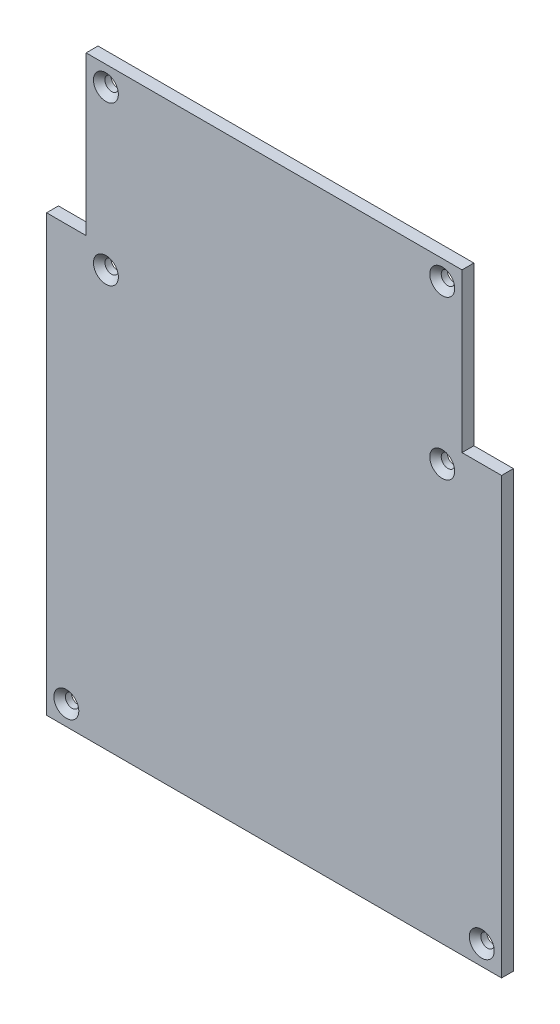
ISO-10303-21;
HEADER;
FILE_DESCRIPTION(('STEP AP214'),'2;1');
FILE_NAME('part.step','',(''),(''),'','','');
FILE_SCHEMA(('AUTOMOTIVE_DESIGN { 1 0 10303 214 1 1 1 1 }'));
ENDSEC;
DATA;
#1=APPLICATION_CONTEXT('core data for automotive mechanical design processes');
#2=APPLICATION_PROTOCOL_DEFINITION('international standard','automotive_design',2000,#1);
#3=PRODUCT_CONTEXT('',#1,'mechanical');
#4=PRODUCT('Part','Part','',(#3));
#5=PRODUCT_RELATED_PRODUCT_CATEGORY('part','',(#4));
#6=PRODUCT_DEFINITION_FORMATION('','',#4);
#7=PRODUCT_DEFINITION_CONTEXT('part definition',#1,'design');
#8=PRODUCT_DEFINITION('design','',#6,#7);
#9=PRODUCT_DEFINITION_SHAPE('','',#8);
#10=(LENGTH_UNIT() NAMED_UNIT(*) SI_UNIT(.MILLI.,.METRE.));
#11=(NAMED_UNIT(*) PLANE_ANGLE_UNIT() SI_UNIT($,.RADIAN.));
#12=(NAMED_UNIT(*) SI_UNIT($,.STERADIAN.) SOLID_ANGLE_UNIT());
#13=UNCERTAINTY_MEASURE_WITH_UNIT(LENGTH_MEASURE(1.E-05),#10,'distance_accuracy_value','');
#14=(GEOMETRIC_REPRESENTATION_CONTEXT(3) GLOBAL_UNCERTAINTY_ASSIGNED_CONTEXT((#13)) GLOBAL_UNIT_ASSIGNED_CONTEXT((#10,
#11,#12)) REPRESENTATION_CONTEXT('',''));
#15=CARTESIAN_POINT('',(0.,0.,0.));
#16=DIRECTION('',(0.,0.,1.));
#17=DIRECTION('',(1.,0.,0.));
#18=AXIS2_PLACEMENT_3D('',#15,#16,#17);
#19=CARTESIAN_POINT('',(47.5,55.,3.));
#20=DIRECTION('',(0.,-1.,0.));
#21=DIRECTION('',(1.,0.,0.));
#22=AXIS2_PLACEMENT_3D('',#19,#20,#21);
#23=PLANE('',#22);
#24=DIRECTION('',(-1.,0.,0.));
#25=VECTOR('',#24,1.);
#26=CARTESIAN_POINT('',(47.5,55.,0.));
#27=LINE('',#26,#25);
#28=CARTESIAN_POINT('',(57.5,55.,0.));
#29=VERTEX_POINT('',#28);
#30=CARTESIAN_POINT('',(47.5,55.,0.));
#31=VERTEX_POINT('',#30);
#32=EDGE_CURVE('E131',#29,#31,#27,.T.);
#33=ORIENTED_EDGE('',*,*,#32,.T.);
#34=DIRECTION('',(0.,0.,-1.));
#35=VECTOR('',#34,1.);
#36=CARTESIAN_POINT('',(47.5,55.,3.));
#37=LINE('',#36,#35);
#38=CARTESIAN_POINT('',(47.5,55.,3.));
#39=VERTEX_POINT('',#38);
#40=EDGE_CURVE('E11',#39,#31,#37,.T.);
#41=ORIENTED_EDGE('',*,*,#40,.F.);
#42=DIRECTION('',(-1.,0.,0.));
#43=VECTOR('',#42,1.);
#44=CARTESIAN_POINT('',(47.5,55.,3.));
#45=LINE('',#44,#43);
#46=CARTESIAN_POINT('',(57.5,55.,3.));
#47=VERTEX_POINT('',#46);
#48=EDGE_CURVE('E146',#47,#39,#45,.T.);
#49=ORIENTED_EDGE('',*,*,#48,.F.);
#50=DIRECTION('',(0.,0.,-1.));
#51=VECTOR('',#50,1.);
#52=CARTESIAN_POINT('',(57.5,55.,3.));
#53=LINE('',#52,#51);
#54=EDGE_CURVE('E127',#47,#29,#53,.T.);
#55=ORIENTED_EDGE('',*,*,#54,.T.);
#56=EDGE_LOOP('',(#33,#41,#49,#55));
#57=FACE_BOUND('',#56,.T.);
#58=ADVANCED_FACE('F33',(#57),#23,.F.);
#59=CARTESIAN_POINT('',(47.5,95.,3.));
#60=DIRECTION('',(-1.,0.,0.));
#61=DIRECTION('',(0.,-1.,0.));
#62=AXIS2_PLACEMENT_3D('',#59,#60,#61);
#63=PLANE('',#62);
#64=DIRECTION('',(0.,1.,0.));
#65=VECTOR('',#64,1.);
#66=CARTESIAN_POINT('',(47.5,95.,0.));
#67=LINE('',#66,#65);
#68=CARTESIAN_POINT('',(47.5,95.,0.));
#69=VERTEX_POINT('',#68);
#70=EDGE_CURVE('E134',#31,#69,#67,.T.);
#71=ORIENTED_EDGE('',*,*,#70,.T.);
#72=DIRECTION('',(0.,0.,-1.));
#73=VECTOR('',#72,1.);
#74=CARTESIAN_POINT('',(47.5,95.,3.));
#75=LINE('',#74,#73);
#76=CARTESIAN_POINT('',(47.5,95.,3.));
#77=VERTEX_POINT('',#76);
#78=EDGE_CURVE('E42',#77,#69,#75,.T.);
#79=ORIENTED_EDGE('',*,*,#78,.F.);
#80=DIRECTION('',(0.,1.,0.));
#81=VECTOR('',#80,1.);
#82=CARTESIAN_POINT('',(47.5,95.,3.));
#83=LINE('',#82,#81);
#84=EDGE_CURVE('E94',#39,#77,#83,.T.);
#85=ORIENTED_EDGE('',*,*,#84,.F.);
#86=ORIENTED_EDGE('',*,*,#40,.T.);
#87=EDGE_LOOP('',(#71,#79,#85,#86));
#88=FACE_BOUND('',#87,.T.);
#89=ADVANCED_FACE('F241',(#88),#63,.F.);
#90=CARTESIAN_POINT('',(-47.5,95.,3.));
#91=DIRECTION('',(0.,-1.,0.));
#92=DIRECTION('',(0.,0.,-1.));
#93=AXIS2_PLACEMENT_3D('',#90,#91,#92);
#94=PLANE('',#93);
#95=DIRECTION('',(-1.,0.,0.));
#96=VECTOR('',#95,1.);
#97=CARTESIAN_POINT('',(-47.5,95.,0.));
#98=LINE('',#97,#96);
#99=CARTESIAN_POINT('',(-47.5,95.,0.));
#100=VERTEX_POINT('',#99);
#101=EDGE_CURVE('E137',#69,#100,#98,.T.);
#102=ORIENTED_EDGE('',*,*,#101,.T.);
#103=DIRECTION('',(0.,0.,-1.));
#104=VECTOR('',#103,1.);
#105=CARTESIAN_POINT('',(-47.5,95.,3.));
#106=LINE('',#105,#104);
#107=CARTESIAN_POINT('',(-47.5,95.,3.));
#108=VERTEX_POINT('',#107);
#109=EDGE_CURVE('E153',#108,#100,#106,.T.);
#110=ORIENTED_EDGE('',*,*,#109,.F.);
#111=DIRECTION('',(-1.,0.,0.));
#112=VECTOR('',#111,1.);
#113=CARTESIAN_POINT('',(-47.5,95.,3.));
#114=LINE('',#113,#112);
#115=EDGE_CURVE('E208',#77,#108,#114,.T.);
#116=ORIENTED_EDGE('',*,*,#115,.F.);
#117=ORIENTED_EDGE('',*,*,#78,.T.);
#118=EDGE_LOOP('',(#102,#110,#116,#117));
#119=FACE_BOUND('',#118,.T.);
#120=ADVANCED_FACE('F245',(#119),#94,.F.);
#121=CARTESIAN_POINT('',(-47.5,95.,3.));
#122=DIRECTION('',(1.,0.,0.));
#123=DIRECTION('',(0.,0.,-1.));
#124=AXIS2_PLACEMENT_3D('',#121,#122,#123);
#125=PLANE('',#124);
#126=DIRECTION('',(0.,-1.,0.));
#127=VECTOR('',#126,1.);
#128=CARTESIAN_POINT('',(-47.5,95.,0.));
#129=LINE('',#128,#127);
#130=CARTESIAN_POINT('',(-47.5,55.,0.));
#131=VERTEX_POINT('',#130);
#132=EDGE_CURVE('E139',#100,#131,#129,.T.);
#133=ORIENTED_EDGE('',*,*,#132,.T.);
#134=DIRECTION('',(0.,0.,-1.));
#135=VECTOR('',#134,1.);
#136=CARTESIAN_POINT('',(-47.5,55.,3.));
#137=LINE('',#136,#135);
#138=CARTESIAN_POINT('',(-47.5,55.,3.));
#139=VERTEX_POINT('',#138);
#140=EDGE_CURVE('E150',#139,#131,#137,.T.);
#141=ORIENTED_EDGE('',*,*,#140,.F.);
#142=DIRECTION('',(0.,-1.,0.));
#143=VECTOR('',#142,1.);
#144=CARTESIAN_POINT('',(-47.5,95.,3.));
#145=LINE('',#144,#143);
#146=EDGE_CURVE('E210',#108,#139,#145,.T.);
#147=ORIENTED_EDGE('',*,*,#146,.F.);
#148=ORIENTED_EDGE('',*,*,#109,.T.);
#149=EDGE_LOOP('',(#133,#141,#147,#148));
#150=FACE_BOUND('',#149,.T.);
#151=ADVANCED_FACE('F216',(#150),#125,.F.);
#152=CARTESIAN_POINT('',(-57.5,55.,3.));
#153=DIRECTION('',(0.,-1.,0.));
#154=DIRECTION('',(1.,0.,0.));
#155=AXIS2_PLACEMENT_3D('',#152,#153,#154);
#156=PLANE('',#155);
#157=DIRECTION('',(-1.,0.,0.));
#158=VECTOR('',#157,1.);
#159=CARTESIAN_POINT('',(-57.5,55.,0.));
#160=LINE('',#159,#158);
#161=CARTESIAN_POINT('',(-57.5,55.,0.));
#162=VERTEX_POINT('',#161);
#163=EDGE_CURVE('E141',#131,#162,#160,.T.);
#164=ORIENTED_EDGE('',*,*,#163,.T.);
#165=DIRECTION('',(0.,0.,-1.));
#166=VECTOR('',#165,1.);
#167=CARTESIAN_POINT('',(-57.5,55.,3.));
#168=LINE('',#167,#166);
#169=CARTESIAN_POINT('',(-57.5,55.,3.));
#170=VERTEX_POINT('',#169);
#171=EDGE_CURVE('E122',#170,#162,#168,.T.);
#172=ORIENTED_EDGE('',*,*,#171,.F.);
#173=DIRECTION('',(-1.,0.,0.));
#174=VECTOR('',#173,1.);
#175=CARTESIAN_POINT('',(-57.5,55.,3.));
#176=LINE('',#175,#174);
#177=EDGE_CURVE('E113',#139,#170,#176,.T.);
#178=ORIENTED_EDGE('',*,*,#177,.F.);
#179=ORIENTED_EDGE('',*,*,#140,.T.);
#180=EDGE_LOOP('',(#164,#172,#178,#179));
#181=FACE_BOUND('',#180,.T.);
#182=ADVANCED_FACE('F220',(#181),#156,.F.);
#183=CARTESIAN_POINT('',(-57.5,-55.,3.));
#184=DIRECTION('',(1.,0.,0.));
#185=DIRECTION('',(0.,0.,-1.));
#186=AXIS2_PLACEMENT_3D('',#183,#184,#185);
#187=PLANE('',#186);
#188=DIRECTION('',(0.,-1.,0.));
#189=VECTOR('',#188,1.);
#190=CARTESIAN_POINT('',(-57.5,-55.,0.));
#191=LINE('',#190,#189);
#192=CARTESIAN_POINT('',(-57.5,-55.,0.));
#193=VERTEX_POINT('',#192);
#194=EDGE_CURVE('E121',#162,#193,#191,.T.);
#195=ORIENTED_EDGE('',*,*,#194,.T.);
#196=DIRECTION('',(0.,0.,-1.));
#197=VECTOR('',#196,1.);
#198=CARTESIAN_POINT('',(-57.5,-55.,3.));
#199=LINE('',#198,#197);
#200=CARTESIAN_POINT('',(-57.5,-55.,3.));
#201=VERTEX_POINT('',#200);
#202=EDGE_CURVE('E118',#201,#193,#199,.T.);
#203=ORIENTED_EDGE('',*,*,#202,.F.);
#204=DIRECTION('',(0.,-1.,0.));
#205=VECTOR('',#204,1.);
#206=CARTESIAN_POINT('',(-57.5,-55.,3.));
#207=LINE('',#206,#205);
#208=EDGE_CURVE('E107',#170,#201,#207,.T.);
#209=ORIENTED_EDGE('',*,*,#208,.F.);
#210=ORIENTED_EDGE('',*,*,#171,.T.);
#211=EDGE_LOOP('',(#195,#203,#209,#210));
#212=FACE_BOUND('',#211,.T.);
#213=ADVANCED_FACE('F119',(#212),#187,.F.);
#214=CARTESIAN_POINT('',(-57.5,-55.,3.));
#215=DIRECTION('',(0.,1.,0.));
#216=DIRECTION('',(-1.,0.,0.));
#217=AXIS2_PLACEMENT_3D('',#214,#215,#216);
#218=PLANE('',#217);
#219=DIRECTION('',(1.,0.,0.));
#220=VECTOR('',#219,1.);
#221=CARTESIAN_POINT('',(-57.5,-55.,0.));
#222=LINE('',#221,#220);
#223=CARTESIAN_POINT('',(57.5,-55.,0.));
#224=VERTEX_POINT('',#223);
#225=EDGE_CURVE('E80',#193,#224,#222,.T.);
#226=ORIENTED_EDGE('',*,*,#225,.T.);
#227=DIRECTION('',(0.,0.,-1.));
#228=VECTOR('',#227,1.);
#229=CARTESIAN_POINT('',(57.5,-55.,3.));
#230=LINE('',#229,#228);
#231=CARTESIAN_POINT('',(57.5,-55.,3.));
#232=VERTEX_POINT('',#231);
#233=EDGE_CURVE('E123',#232,#224,#230,.T.);
#234=ORIENTED_EDGE('',*,*,#233,.F.);
#235=DIRECTION('',(1.,0.,0.));
#236=VECTOR('',#235,1.);
#237=CARTESIAN_POINT('',(-57.5,-55.,3.));
#238=LINE('',#237,#236);
#239=EDGE_CURVE('E111',#201,#232,#238,.T.);
#240=ORIENTED_EDGE('',*,*,#239,.F.);
#241=ORIENTED_EDGE('',*,*,#202,.T.);
#242=EDGE_LOOP('',(#226,#234,#240,#241));
#243=FACE_BOUND('',#242,.T.);
#244=ADVANCED_FACE('F125',(#243),#218,.F.);
#245=CARTESIAN_POINT('',(57.5,-55.,3.));
#246=DIRECTION('',(-1.,0.,0.));
#247=DIRECTION('',(0.,0.,1.));
#248=AXIS2_PLACEMENT_3D('',#245,#246,#247);
#249=PLANE('',#248);
#250=DIRECTION('',(0.,1.,0.));
#251=VECTOR('',#250,1.);
#252=CARTESIAN_POINT('',(57.5,-55.,0.));
#253=LINE('',#252,#251);
#254=EDGE_CURVE('E86',#224,#29,#253,.T.);
#255=ORIENTED_EDGE('',*,*,#254,.T.);
#256=ORIENTED_EDGE('',*,*,#54,.F.);
#257=DIRECTION('',(0.,1.,0.));
#258=VECTOR('',#257,1.);
#259=CARTESIAN_POINT('',(57.5,-55.,3.));
#260=LINE('',#259,#258);
#261=EDGE_CURVE('E51',#232,#47,#260,.T.);
#262=ORIENTED_EDGE('',*,*,#261,.F.);
#263=ORIENTED_EDGE('',*,*,#233,.T.);
#264=EDGE_LOOP('',(#255,#256,#262,#263));
#265=FACE_BOUND('',#264,.T.);
#266=ADVANCED_FACE('F228',(#265),#249,.F.);
#267=CARTESIAN_POINT('',(0.,0.,3.));
#268=DIRECTION('',(0.,0.,1.));
#269=DIRECTION('',(1.,0.,0.));
#270=AXIS2_PLACEMENT_3D('',#267,#268,#269);
#271=PLANE('',#270);
#272=CARTESIAN_POINT('',(-52.5,-50.,3.));
#273=DIRECTION('',(0.,0.,1.));
#274=DIRECTION('',(1.,0.,0.));
#275=AXIS2_PLACEMENT_3D('',#272,#273,#274);
#276=CIRCLE('',#275,3.15);
#277=CARTESIAN_POINT('',(-49.35,-50.,3.));
#278=VERTEX_POINT('',#277);
#279=EDGE_CURVE('E407',#278,#278,#276,.T.);
#280=ORIENTED_EDGE('',*,*,#279,.F.);
#281=EDGE_LOOP('',(#280));
#282=FACE_BOUND('',#281,.T.);
#283=CARTESIAN_POINT('',(-42.5,90.,3.));
#284=DIRECTION('',(0.,0.,1.));
#285=DIRECTION('',(1.,0.,0.));
#286=AXIS2_PLACEMENT_3D('',#283,#284,#285);
#287=CIRCLE('',#286,3.15);
#288=CARTESIAN_POINT('',(-39.35,90.,3.));
#289=VERTEX_POINT('',#288);
#290=EDGE_CURVE('E184',#289,#289,#287,.T.);
#291=ORIENTED_EDGE('',*,*,#290,.F.);
#292=EDGE_LOOP('',(#291));
#293=FACE_BOUND('',#292,.T.);
#294=CARTESIAN_POINT('',(-42.5,50.,3.));
#295=DIRECTION('',(0.,0.,1.));
#296=DIRECTION('',(1.,0.,0.));
#297=AXIS2_PLACEMENT_3D('',#294,#295,#296);
#298=CIRCLE('',#297,3.15);
#299=CARTESIAN_POINT('',(-39.35,50.,3.));
#300=VERTEX_POINT('',#299);
#301=EDGE_CURVE('E177',#300,#300,#298,.T.);
#302=ORIENTED_EDGE('',*,*,#301,.F.);
#303=EDGE_LOOP('',(#302));
#304=FACE_BOUND('',#303,.T.);
#305=CARTESIAN_POINT('',(42.5,90.,3.));
#306=DIRECTION('',(0.,0.,1.));
#307=DIRECTION('',(1.,0.,0.));
#308=AXIS2_PLACEMENT_3D('',#305,#306,#307);
#309=CIRCLE('',#308,3.15);
#310=CARTESIAN_POINT('',(45.65,90.,3.));
#311=VERTEX_POINT('',#310);
#312=EDGE_CURVE('E173',#311,#311,#309,.T.);
#313=ORIENTED_EDGE('',*,*,#312,.F.);
#314=EDGE_LOOP('',(#313));
#315=FACE_BOUND('',#314,.T.);
#316=CARTESIAN_POINT('',(42.5,50.,3.));
#317=DIRECTION('',(0.,0.,1.));
#318=DIRECTION('',(1.,0.,0.));
#319=AXIS2_PLACEMENT_3D('',#316,#317,#318);
#320=CIRCLE('',#319,3.15);
#321=CARTESIAN_POINT('',(45.65,50.,3.));
#322=VERTEX_POINT('',#321);
#323=EDGE_CURVE('E169',#322,#322,#320,.T.);
#324=ORIENTED_EDGE('',*,*,#323,.F.);
#325=EDGE_LOOP('',(#324));
#326=FACE_BOUND('',#325,.T.);
#327=CARTESIAN_POINT('',(52.5,-50.,3.));
#328=DIRECTION('',(0.,0.,1.));
#329=DIRECTION('',(1.,0.,0.));
#330=AXIS2_PLACEMENT_3D('',#327,#328,#329);
#331=CIRCLE('',#330,3.15);
#332=CARTESIAN_POINT('',(55.65,-50.,3.));
#333=VERTEX_POINT('',#332);
#334=EDGE_CURVE('E164',#333,#333,#331,.T.);
#335=ORIENTED_EDGE('',*,*,#334,.F.);
#336=EDGE_LOOP('',(#335));
#337=FACE_BOUND('',#336,.T.);
#338=ORIENTED_EDGE('',*,*,#48,.T.);
#339=ORIENTED_EDGE('',*,*,#84,.T.);
#340=ORIENTED_EDGE('',*,*,#115,.T.);
#341=ORIENTED_EDGE('',*,*,#146,.T.);
#342=ORIENTED_EDGE('',*,*,#177,.T.);
#343=ORIENTED_EDGE('',*,*,#208,.T.);
#344=ORIENTED_EDGE('',*,*,#239,.T.);
#345=ORIENTED_EDGE('',*,*,#261,.T.);
#346=EDGE_LOOP('',(#338,#339,#340,#341,#342,#343,#344,#345));
#347=FACE_BOUND('',#346,.T.);
#348=ADVANCED_FACE('F109',(#282,#293,#304,#315,#326,#337,#347),#271,.T.);
#349=CARTESIAN_POINT('',(0.,0.,0.));
#350=DIRECTION('',(0.,0.,1.));
#351=DIRECTION('',(1.,0.,0.));
#352=AXIS2_PLACEMENT_3D('',#349,#350,#351);
#353=PLANE('',#352);
#354=CARTESIAN_POINT('',(-52.5,-50.,0.));
#355=DIRECTION('',(0.,0.,1.));
#356=DIRECTION('',(1.,0.,0.));
#357=AXIS2_PLACEMENT_3D('',#354,#355,#356);
#358=CIRCLE('',#357,1.7);
#359=CARTESIAN_POINT('',(-50.8,-50.,0.));
#360=VERTEX_POINT('',#359);
#361=EDGE_CURVE('E36',#360,#360,#358,.T.);
#362=ORIENTED_EDGE('',*,*,#361,.T.);
#363=EDGE_LOOP('',(#362));
#364=FACE_BOUND('',#363,.T.);
#365=CARTESIAN_POINT('',(-42.5,90.,0.));
#366=DIRECTION('',(0.,0.,1.));
#367=DIRECTION('',(1.,0.,0.));
#368=AXIS2_PLACEMENT_3D('',#365,#366,#367);
#369=CIRCLE('',#368,1.7);
#370=CARTESIAN_POINT('',(-40.8,90.,0.));
#371=VERTEX_POINT('',#370);
#372=EDGE_CURVE('E175',#371,#371,#369,.T.);
#373=ORIENTED_EDGE('',*,*,#372,.T.);
#374=EDGE_LOOP('',(#373));
#375=FACE_BOUND('',#374,.T.);
#376=CARTESIAN_POINT('',(-42.5,50.,0.));
#377=DIRECTION('',(0.,0.,1.));
#378=DIRECTION('',(1.,0.,0.));
#379=AXIS2_PLACEMENT_3D('',#376,#377,#378);
#380=CIRCLE('',#379,1.7);
#381=CARTESIAN_POINT('',(-40.8,50.,0.));
#382=VERTEX_POINT('',#381);
#383=EDGE_CURVE('E171',#382,#382,#380,.T.);
#384=ORIENTED_EDGE('',*,*,#383,.T.);
#385=EDGE_LOOP('',(#384));
#386=FACE_BOUND('',#385,.T.);
#387=CARTESIAN_POINT('',(42.5,90.,0.));
#388=DIRECTION('',(0.,0.,1.));
#389=DIRECTION('',(1.,0.,0.));
#390=AXIS2_PLACEMENT_3D('',#387,#388,#389);
#391=CIRCLE('',#390,1.7);
#392=CARTESIAN_POINT('',(44.2,90.,0.));
#393=VERTEX_POINT('',#392);
#394=EDGE_CURVE('E166',#393,#393,#391,.T.);
#395=ORIENTED_EDGE('',*,*,#394,.T.);
#396=EDGE_LOOP('',(#395));
#397=FACE_BOUND('',#396,.T.);
#398=CARTESIAN_POINT('',(42.5,50.,0.));
#399=DIRECTION('',(0.,0.,1.));
#400=DIRECTION('',(1.,0.,0.));
#401=AXIS2_PLACEMENT_3D('',#398,#399,#400);
#402=CIRCLE('',#401,1.7);
#403=CARTESIAN_POINT('',(44.2,50.,0.));
#404=VERTEX_POINT('',#403);
#405=EDGE_CURVE('E161',#404,#404,#402,.T.);
#406=ORIENTED_EDGE('',*,*,#405,.T.);
#407=EDGE_LOOP('',(#406));
#408=FACE_BOUND('',#407,.T.);
#409=CARTESIAN_POINT('',(52.5,-50.,0.));
#410=DIRECTION('',(0.,0.,1.));
#411=DIRECTION('',(1.,0.,0.));
#412=AXIS2_PLACEMENT_3D('',#409,#410,#411);
#413=CIRCLE('',#412,1.7);
#414=CARTESIAN_POINT('',(54.2,-50.,0.));
#415=VERTEX_POINT('',#414);
#416=EDGE_CURVE('E135',#415,#415,#413,.T.);
#417=ORIENTED_EDGE('',*,*,#416,.T.);
#418=EDGE_LOOP('',(#417));
#419=FACE_BOUND('',#418,.T.);
#420=ORIENTED_EDGE('',*,*,#32,.F.);
#421=ORIENTED_EDGE('',*,*,#254,.F.);
#422=ORIENTED_EDGE('',*,*,#225,.F.);
#423=ORIENTED_EDGE('',*,*,#194,.F.);
#424=ORIENTED_EDGE('',*,*,#163,.F.);
#425=ORIENTED_EDGE('',*,*,#132,.F.);
#426=ORIENTED_EDGE('',*,*,#101,.F.);
#427=ORIENTED_EDGE('',*,*,#70,.F.);
#428=EDGE_LOOP('',(#420,#421,#422,#423,#424,#425,#426,#427));
#429=FACE_BOUND('',#428,.T.);
#430=ADVANCED_FACE('F223',(#364,#375,#386,#397,#408,#419,#429),#353,.F.);
#431=CARTESIAN_POINT('',(52.5,-50.,3.));
#432=DIRECTION('',(0.,0.,1.));
#433=DIRECTION('',(1.,0.,0.));
#434=AXIS2_PLACEMENT_3D('',#431,#432,#433);
#435=CYLINDRICAL_SURFACE('',#434,1.7);
#436=CARTESIAN_POINT('',(52.5,-50.,1.55));
#437=DIRECTION('',(0.,0.,1.));
#438=DIRECTION('',(1.,0.,0.));
#439=AXIS2_PLACEMENT_3D('',#436,#437,#438);
#440=CIRCLE('',#439,1.7);
#441=CARTESIAN_POINT('',(54.2,-50.,1.55));
#442=VERTEX_POINT('',#441);
#443=EDGE_CURVE('E160',#442,#442,#440,.T.);
#444=ORIENTED_EDGE('',*,*,#443,.T.);
#445=EDGE_LOOP('',(#444));
#446=FACE_BOUND('',#445,.T.);
#447=ORIENTED_EDGE('',*,*,#416,.F.);
#448=EDGE_LOOP('',(#447));
#449=FACE_BOUND('',#448,.T.);
#450=ADVANCED_FACE('F280',(#446,#449),#435,.F.);
#451=CARTESIAN_POINT('',(52.5,-50.,3.));
#452=DIRECTION('',(0.,0.,1.));
#453=DIRECTION('',(1.,0.,0.));
#454=AXIS2_PLACEMENT_3D('',#451,#452,#453);
#455=CONICAL_SURFACE('',#454,3.15,0.785398163397448);
#456=ORIENTED_EDGE('',*,*,#443,.F.);
#457=EDGE_LOOP('',(#456));
#458=FACE_BOUND('',#457,.T.);
#459=ORIENTED_EDGE('',*,*,#334,.T.);
#460=EDGE_LOOP('',(#459));
#461=FACE_BOUND('',#460,.T.);
#462=ADVANCED_FACE('F288',(#458,#461),#455,.F.);
#463=CARTESIAN_POINT('',(42.5,50.,3.));
#464=DIRECTION('',(0.,0.,1.));
#465=DIRECTION('',(1.,0.,0.));
#466=AXIS2_PLACEMENT_3D('',#463,#464,#465);
#467=CYLINDRICAL_SURFACE('',#466,1.7);
#468=CARTESIAN_POINT('',(42.5,50.,1.55));
#469=DIRECTION('',(0.,0.,1.));
#470=DIRECTION('',(1.,0.,0.));
#471=AXIS2_PLACEMENT_3D('',#468,#469,#470);
#472=CIRCLE('',#471,1.7);
#473=CARTESIAN_POINT('',(44.2,50.,1.55));
#474=VERTEX_POINT('',#473);
#475=EDGE_CURVE('E165',#474,#474,#472,.T.);
#476=ORIENTED_EDGE('',*,*,#475,.T.);
#477=EDGE_LOOP('',(#476));
#478=FACE_BOUND('',#477,.T.);
#479=ORIENTED_EDGE('',*,*,#405,.F.);
#480=EDGE_LOOP('',(#479));
#481=FACE_BOUND('',#480,.T.);
#482=ADVANCED_FACE('F298',(#478,#481),#467,.F.);
#483=CARTESIAN_POINT('',(42.5,50.,3.));
#484=DIRECTION('',(0.,0.,1.));
#485=DIRECTION('',(1.,0.,0.));
#486=AXIS2_PLACEMENT_3D('',#483,#484,#485);
#487=CONICAL_SURFACE('',#486,3.15,0.785398163397448);
#488=ORIENTED_EDGE('',*,*,#475,.F.);
#489=EDGE_LOOP('',(#488));
#490=FACE_BOUND('',#489,.T.);
#491=ORIENTED_EDGE('',*,*,#323,.T.);
#492=EDGE_LOOP('',(#491));
#493=FACE_BOUND('',#492,.T.);
#494=ADVANCED_FACE('F308',(#490,#493),#487,.F.);
#495=CARTESIAN_POINT('',(42.5,90.,3.));
#496=DIRECTION('',(0.,0.,1.));
#497=DIRECTION('',(1.,0.,0.));
#498=AXIS2_PLACEMENT_3D('',#495,#496,#497);
#499=CYLINDRICAL_SURFACE('',#498,1.7);
#500=CARTESIAN_POINT('',(42.5,90.,1.55));
#501=DIRECTION('',(0.,0.,1.));
#502=DIRECTION('',(1.,0.,0.));
#503=AXIS2_PLACEMENT_3D('',#500,#501,#502);
#504=CIRCLE('',#503,1.7);
#505=CARTESIAN_POINT('',(44.2,90.,1.55));
#506=VERTEX_POINT('',#505);
#507=EDGE_CURVE('E170',#506,#506,#504,.T.);
#508=ORIENTED_EDGE('',*,*,#507,.T.);
#509=EDGE_LOOP('',(#508));
#510=FACE_BOUND('',#509,.T.);
#511=ORIENTED_EDGE('',*,*,#394,.F.);
#512=EDGE_LOOP('',(#511));
#513=FACE_BOUND('',#512,.T.);
#514=ADVANCED_FACE('F318',(#510,#513),#499,.F.);
#515=CARTESIAN_POINT('',(42.5,90.,3.));
#516=DIRECTION('',(0.,0.,1.));
#517=DIRECTION('',(1.,0.,0.));
#518=AXIS2_PLACEMENT_3D('',#515,#516,#517);
#519=CONICAL_SURFACE('',#518,3.15,0.785398163397448);
#520=ORIENTED_EDGE('',*,*,#507,.F.);
#521=EDGE_LOOP('',(#520));
#522=FACE_BOUND('',#521,.T.);
#523=ORIENTED_EDGE('',*,*,#312,.T.);
#524=EDGE_LOOP('',(#523));
#525=FACE_BOUND('',#524,.T.);
#526=ADVANCED_FACE('F328',(#522,#525),#519,.F.);
#527=CARTESIAN_POINT('',(-42.5,50.,3.));
#528=DIRECTION('',(0.,0.,1.));
#529=DIRECTION('',(1.,0.,0.));
#530=AXIS2_PLACEMENT_3D('',#527,#528,#529);
#531=CYLINDRICAL_SURFACE('',#530,1.7);
#532=CARTESIAN_POINT('',(-42.5,50.,1.55));
#533=DIRECTION('',(0.,0.,1.));
#534=DIRECTION('',(1.,0.,0.));
#535=AXIS2_PLACEMENT_3D('',#532,#533,#534);
#536=CIRCLE('',#535,1.7);
#537=CARTESIAN_POINT('',(-40.8,50.,1.55));
#538=VERTEX_POINT('',#537);
#539=EDGE_CURVE('E174',#538,#538,#536,.T.);
#540=ORIENTED_EDGE('',*,*,#539,.T.);
#541=EDGE_LOOP('',(#540));
#542=FACE_BOUND('',#541,.T.);
#543=ORIENTED_EDGE('',*,*,#383,.F.);
#544=EDGE_LOOP('',(#543));
#545=FACE_BOUND('',#544,.T.);
#546=ADVANCED_FACE('F338',(#542,#545),#531,.F.);
#547=CARTESIAN_POINT('',(-42.5,50.,3.));
#548=DIRECTION('',(0.,0.,1.));
#549=DIRECTION('',(1.,0.,0.));
#550=AXIS2_PLACEMENT_3D('',#547,#548,#549);
#551=CONICAL_SURFACE('',#550,3.15,0.785398163397448);
#552=ORIENTED_EDGE('',*,*,#539,.F.);
#553=EDGE_LOOP('',(#552));
#554=FACE_BOUND('',#553,.T.);
#555=ORIENTED_EDGE('',*,*,#301,.T.);
#556=EDGE_LOOP('',(#555));
#557=FACE_BOUND('',#556,.T.);
#558=ADVANCED_FACE('F348',(#554,#557),#551,.F.);
#559=CARTESIAN_POINT('',(-42.5,90.,3.));
#560=DIRECTION('',(0.,0.,1.));
#561=DIRECTION('',(1.,0.,0.));
#562=AXIS2_PLACEMENT_3D('',#559,#560,#561);
#563=CYLINDRICAL_SURFACE('',#562,1.7);
#564=CARTESIAN_POINT('',(-42.5,90.,1.55));
#565=DIRECTION('',(0.,0.,1.));
#566=DIRECTION('',(1.,0.,0.));
#567=AXIS2_PLACEMENT_3D('',#564,#565,#566);
#568=CIRCLE('',#567,1.7);
#569=CARTESIAN_POINT('',(-40.8,90.,1.55));
#570=VERTEX_POINT('',#569);
#571=EDGE_CURVE('E178',#570,#570,#568,.T.);
#572=ORIENTED_EDGE('',*,*,#571,.T.);
#573=EDGE_LOOP('',(#572));
#574=FACE_BOUND('',#573,.T.);
#575=ORIENTED_EDGE('',*,*,#372,.F.);
#576=EDGE_LOOP('',(#575));
#577=FACE_BOUND('',#576,.T.);
#578=ADVANCED_FACE('F358',(#574,#577),#563,.F.);
#579=CARTESIAN_POINT('',(-42.5,90.,3.));
#580=DIRECTION('',(0.,0.,1.));
#581=DIRECTION('',(1.,0.,0.));
#582=AXIS2_PLACEMENT_3D('',#579,#580,#581);
#583=CONICAL_SURFACE('',#582,3.15,0.785398163397448);
#584=ORIENTED_EDGE('',*,*,#571,.F.);
#585=EDGE_LOOP('',(#584));
#586=FACE_BOUND('',#585,.T.);
#587=ORIENTED_EDGE('',*,*,#290,.T.);
#588=EDGE_LOOP('',(#587));
#589=FACE_BOUND('',#588,.T.);
#590=ADVANCED_FACE('F368',(#586,#589),#583,.F.);
#591=CARTESIAN_POINT('',(-52.5,-50.,3.));
#592=DIRECTION('',(0.,0.,1.));
#593=DIRECTION('',(1.,0.,0.));
#594=AXIS2_PLACEMENT_3D('',#591,#592,#593);
#595=CYLINDRICAL_SURFACE('',#594,1.7);
#596=CARTESIAN_POINT('',(-52.5,-50.,1.55));
#597=DIRECTION('',(0.,0.,1.));
#598=DIRECTION('',(1.,0.,0.));
#599=AXIS2_PLACEMENT_3D('',#596,#597,#598);
#600=CIRCLE('',#599,1.7);
#601=CARTESIAN_POINT('',(-50.8,-50.,1.55));
#602=VERTEX_POINT('',#601);
#603=EDGE_CURVE('E404',#602,#602,#600,.T.);
#604=ORIENTED_EDGE('',*,*,#603,.T.);
#605=EDGE_LOOP('',(#604));
#606=FACE_BOUND('',#605,.T.);
#607=ORIENTED_EDGE('',*,*,#361,.F.);
#608=EDGE_LOOP('',(#607));
#609=FACE_BOUND('',#608,.T.);
#610=ADVANCED_FACE('F377',(#606,#609),#595,.F.);
#611=CARTESIAN_POINT('',(-52.5,-50.,3.));
#612=DIRECTION('',(0.,0.,1.));
#613=DIRECTION('',(1.,0.,0.));
#614=AXIS2_PLACEMENT_3D('',#611,#612,#613);
#615=CONICAL_SURFACE('',#614,3.15,0.785398163397448);
#616=ORIENTED_EDGE('',*,*,#603,.F.);
#617=EDGE_LOOP('',(#616));
#618=FACE_BOUND('',#617,.T.);
#619=ORIENTED_EDGE('',*,*,#279,.T.);
#620=EDGE_LOOP('',(#619));
#621=FACE_BOUND('',#620,.T.);
#622=ADVANCED_FACE('F387',(#618,#621),#615,.F.);
#623=CLOSED_SHELL('',(#58,#89,#120,#151,#182,#213,#244,#266,#348,#430,#450,#462,#482,#494,#514,
#526,#546,#558,#578,#590,#610,#622));
#624=MANIFOLD_SOLID_BREP('B2',#623);
#625=ADVANCED_BREP_SHAPE_REPRESENTATION('',(#18,#624),#14);
#626=SHAPE_DEFINITION_REPRESENTATION(#9,#625);
ENDSEC;
END-ISO-10303-21;
